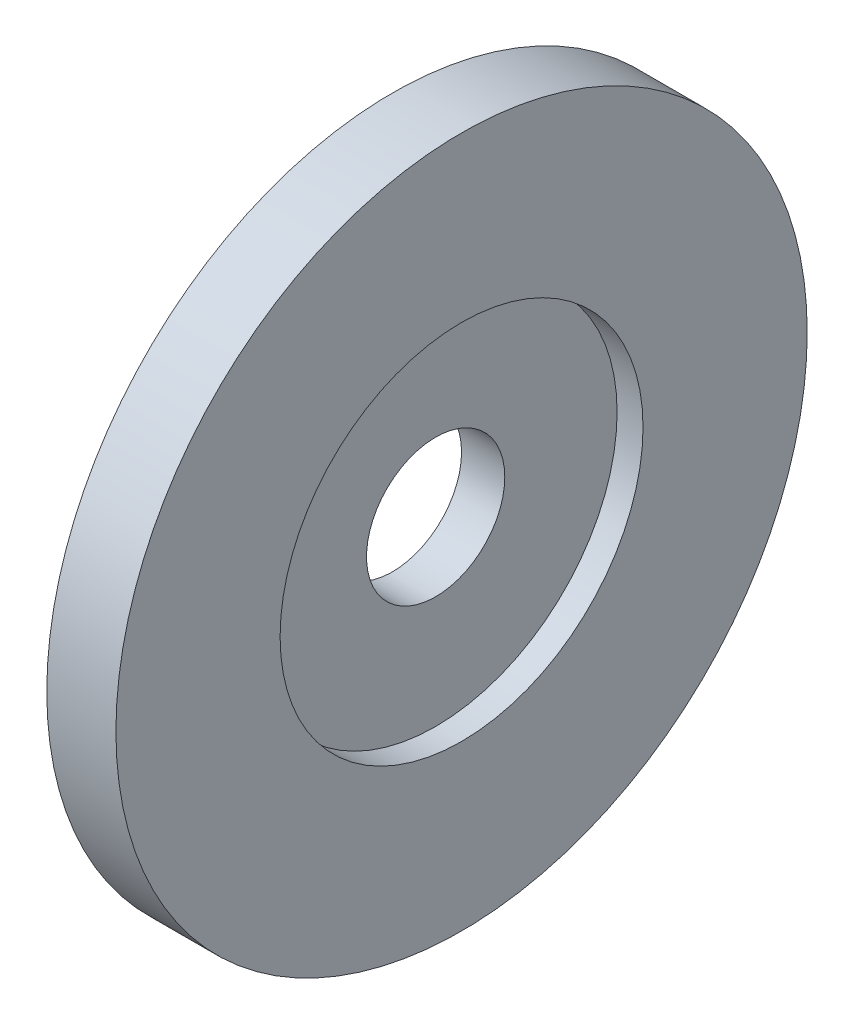
ISO-10303-21;
HEADER;
FILE_DESCRIPTION(('STEP AP214'),'2;1');
FILE_NAME('part.step','',(''),(''),'','','');
FILE_SCHEMA(('AUTOMOTIVE_DESIGN { 1 0 10303 214 1 1 1 1 }'));
ENDSEC;
DATA;
#1=APPLICATION_CONTEXT('core data for automotive mechanical design processes');
#2=APPLICATION_PROTOCOL_DEFINITION('international standard','automotive_design',2000,#1);
#3=PRODUCT_CONTEXT('',#1,'mechanical');
#4=PRODUCT('Part','Part','',(#3));
#5=PRODUCT_RELATED_PRODUCT_CATEGORY('part','',(#4));
#6=PRODUCT_DEFINITION_FORMATION('','',#4);
#7=PRODUCT_DEFINITION_CONTEXT('part definition',#1,'design');
#8=PRODUCT_DEFINITION('design','',#6,#7);
#9=PRODUCT_DEFINITION_SHAPE('','',#8);
#10=(LENGTH_UNIT() NAMED_UNIT(*) SI_UNIT(.MILLI.,.METRE.));
#11=(NAMED_UNIT(*) PLANE_ANGLE_UNIT() SI_UNIT($,.RADIAN.));
#12=(NAMED_UNIT(*) SI_UNIT($,.STERADIAN.) SOLID_ANGLE_UNIT());
#13=UNCERTAINTY_MEASURE_WITH_UNIT(LENGTH_MEASURE(1.E-05),#10,'distance_accuracy_value','');
#14=(GEOMETRIC_REPRESENTATION_CONTEXT(3) GLOBAL_UNCERTAINTY_ASSIGNED_CONTEXT((#13)) GLOBAL_UNIT_ASSIGNED_CONTEXT((#10,
#11,#12)) REPRESENTATION_CONTEXT('',''));
#15=CARTESIAN_POINT('',(0.,0.,0.));
#16=DIRECTION('',(0.,0.,1.));
#17=DIRECTION('',(1.,0.,0.));
#18=AXIS2_PLACEMENT_3D('',#15,#16,#17);
#19=CARTESIAN_POINT('',(4.,0.,70.));
#20=DIRECTION('',(-1.,0.,0.));
#21=DIRECTION('',(0.,0.,1.));
#22=AXIS2_PLACEMENT_3D('',#19,#20,#21);
#23=CYLINDRICAL_SURFACE('',#22,4.00000000000001);
#24=CARTESIAN_POINT('',(0.,0.,70.));
#25=DIRECTION('',(1.,0.,0.));
#26=DIRECTION('',(0.,0.,-1.));
#27=AXIS2_PLACEMENT_3D('',#24,#25,#26);
#28=CIRCLE('',#27,4.00000000000001);
#29=CARTESIAN_POINT('',(0.,0.,66.));
#30=VERTEX_POINT('',#29);
#31=EDGE_CURVE('E44',#30,#30,#28,.T.);
#32=ORIENTED_EDGE('',*,*,#31,.F.);
#33=EDGE_LOOP('',(#32));
#34=FACE_BOUND('',#33,.T.);
#35=CARTESIAN_POINT('',(2.5,0.,70.));
#36=DIRECTION('',(1.,0.,0.));
#37=DIRECTION('',(0.,0.,-1.));
#38=AXIS2_PLACEMENT_3D('',#35,#36,#37);
#39=CIRCLE('',#38,4.00000000000001);
#40=CARTESIAN_POINT('',(2.5,0.,66.));
#41=VERTEX_POINT('',#40);
#42=EDGE_CURVE('E35',#41,#41,#39,.T.);
#43=ORIENTED_EDGE('',*,*,#42,.T.);
#44=EDGE_LOOP('',(#43));
#45=FACE_BOUND('',#44,.T.);
#46=ADVANCED_FACE('F31',(#34,#45),#23,.F.);
#47=CARTESIAN_POINT('',(4.,0.,70.));
#48=DIRECTION('',(1.,0.,0.));
#49=DIRECTION('',(0.,0.,-1.));
#50=AXIS2_PLACEMENT_3D('',#47,#48,#49);
#51=PLANE('',#50);
#52=CARTESIAN_POINT('',(4.,0.,70.));
#53=DIRECTION('',(1.,0.,0.));
#54=DIRECTION('',(0.,0.,-1.));
#55=AXIS2_PLACEMENT_3D('',#52,#53,#54);
#56=CIRCLE('',#55,10.5);
#57=CARTESIAN_POINT('',(4.,0.,59.5));
#58=VERTEX_POINT('',#57);
#59=EDGE_CURVE('E48',#58,#58,#56,.T.);
#60=ORIENTED_EDGE('',*,*,#59,.F.);
#61=EDGE_LOOP('',(#60));
#62=FACE_BOUND('',#61,.T.);
#63=CARTESIAN_POINT('',(4.,0.,70.));
#64=DIRECTION('',(1.,0.,0.));
#65=DIRECTION('',(0.,0.,-1.));
#66=AXIS2_PLACEMENT_3D('',#63,#64,#65);
#67=CIRCLE('',#66,20.);
#68=CARTESIAN_POINT('',(4.,0.,50.));
#69=VERTEX_POINT('',#68);
#70=EDGE_CURVE('E10',#69,#69,#67,.T.);
#71=ORIENTED_EDGE('',*,*,#70,.T.);
#72=EDGE_LOOP('',(#71));
#73=FACE_BOUND('',#72,.T.);
#74=ADVANCED_FACE('F69',(#62,#73),#51,.T.);
#75=CARTESIAN_POINT('',(0.,0.,70.));
#76=DIRECTION('',(1.,0.,0.));
#77=DIRECTION('',(0.,0.,-1.));
#78=AXIS2_PLACEMENT_3D('',#75,#76,#77);
#79=PLANE('',#78);
#80=CARTESIAN_POINT('',(0.,0.,70.));
#81=DIRECTION('',(1.,0.,0.));
#82=DIRECTION('',(0.,0.,-1.));
#83=AXIS2_PLACEMENT_3D('',#80,#81,#82);
#84=CIRCLE('',#83,20.);
#85=CARTESIAN_POINT('',(0.,0.,50.));
#86=VERTEX_POINT('',#85);
#87=EDGE_CURVE('E39',#86,#86,#84,.T.);
#88=ORIENTED_EDGE('',*,*,#87,.F.);
#89=EDGE_LOOP('',(#88));
#90=FACE_BOUND('',#89,.T.);
#91=ORIENTED_EDGE('',*,*,#31,.T.);
#92=EDGE_LOOP('',(#91));
#93=FACE_BOUND('',#92,.T.);
#94=ADVANCED_FACE('F75',(#90,#93),#79,.F.);
#95=CARTESIAN_POINT('',(4.,0.,70.));
#96=DIRECTION('',(-1.,0.,0.));
#97=DIRECTION('',(0.,0.,1.));
#98=AXIS2_PLACEMENT_3D('',#95,#96,#97);
#99=CYLINDRICAL_SURFACE('',#98,20.);
#100=ORIENTED_EDGE('',*,*,#70,.F.);
#101=EDGE_LOOP('',(#100));
#102=FACE_BOUND('',#101,.T.);
#103=ORIENTED_EDGE('',*,*,#87,.T.);
#104=EDGE_LOOP('',(#103));
#105=FACE_BOUND('',#104,.T.);
#106=ADVANCED_FACE('F33',(#102,#105),#99,.T.);
#107=CARTESIAN_POINT('',(2.5,0.,70.));
#108=DIRECTION('',(1.,0.,0.));
#109=DIRECTION('',(0.,0.,-1.));
#110=AXIS2_PLACEMENT_3D('',#107,#108,#109);
#111=CYLINDRICAL_SURFACE('',#110,10.5);
#112=CARTESIAN_POINT('',(2.5,0.,70.));
#113=DIRECTION('',(1.,0.,0.));
#114=DIRECTION('',(0.,0.,-1.));
#115=AXIS2_PLACEMENT_3D('',#112,#113,#114);
#116=CIRCLE('',#115,10.5);
#117=CARTESIAN_POINT('',(2.5,0.,59.5));
#118=VERTEX_POINT('',#117);
#119=EDGE_CURVE('E51',#118,#118,#116,.T.);
#120=ORIENTED_EDGE('',*,*,#119,.F.);
#121=EDGE_LOOP('',(#120));
#122=FACE_BOUND('',#121,.T.);
#123=ORIENTED_EDGE('',*,*,#59,.T.);
#124=EDGE_LOOP('',(#123));
#125=FACE_BOUND('',#124,.T.);
#126=ADVANCED_FACE('F61',(#122,#125),#111,.F.);
#127=CARTESIAN_POINT('',(2.5,0.,70.));
#128=DIRECTION('',(1.,0.,0.));
#129=DIRECTION('',(0.,0.,-1.));
#130=AXIS2_PLACEMENT_3D('',#127,#128,#129);
#131=PLANE('',#130);
#132=ORIENTED_EDGE('',*,*,#42,.F.);
#133=EDGE_LOOP('',(#132));
#134=FACE_BOUND('',#133,.T.);
#135=ORIENTED_EDGE('',*,*,#119,.T.);
#136=EDGE_LOOP('',(#135));
#137=FACE_BOUND('',#136,.T.);
#138=ADVANCED_FACE('F59',(#134,#137),#131,.T.);
#139=CLOSED_SHELL('',(#46,#74,#94,#106,#126,#138));
#140=MANIFOLD_SOLID_BREP('B2',#139);
#141=ADVANCED_BREP_SHAPE_REPRESENTATION('',(#18,#140),#14);
#142=SHAPE_DEFINITION_REPRESENTATION(#9,#141);
ENDSEC;
END-ISO-10303-21;
